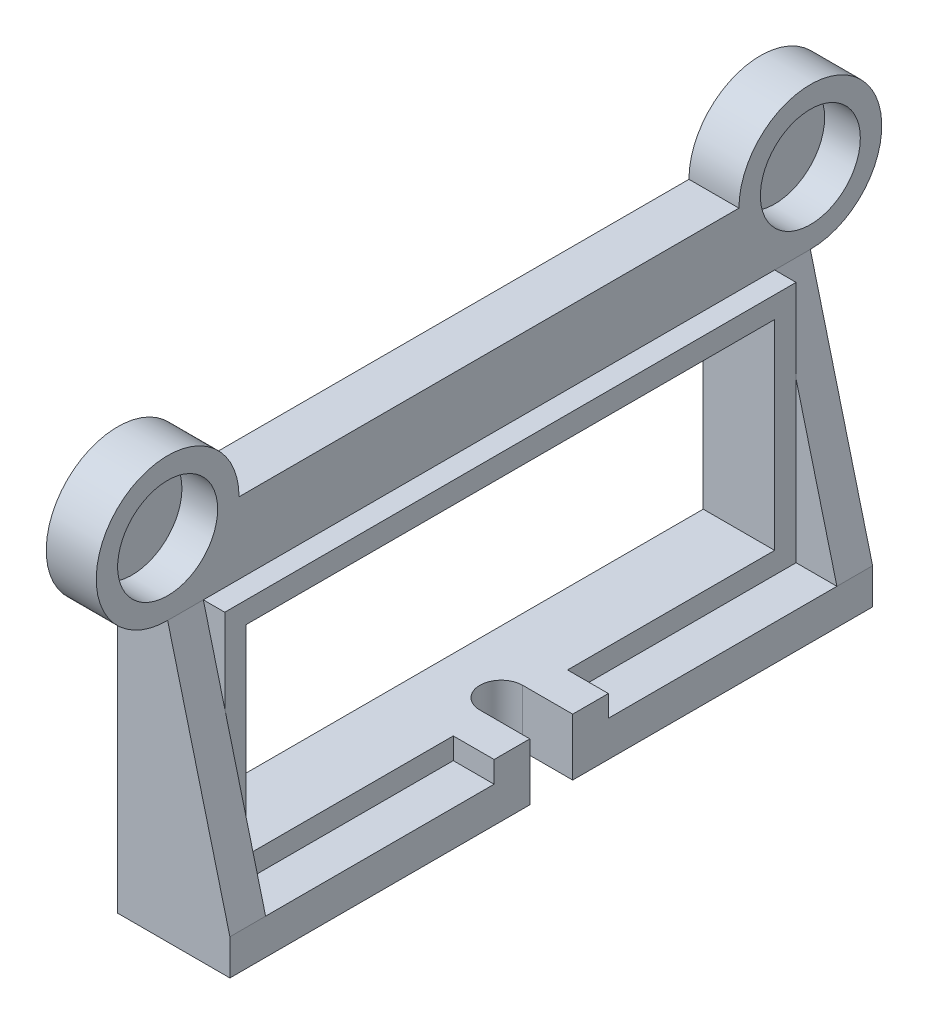
ISO-10303-21;
HEADER;
FILE_DESCRIPTION(('STEP AP214'),'2;1');
FILE_NAME('part.step','',(''),(''),'','','');
FILE_SCHEMA(('AUTOMOTIVE_DESIGN { 1 0 10303 214 1 1 1 1 }'));
ENDSEC;
DATA;
#1=APPLICATION_CONTEXT('core data for automotive mechanical design processes');
#2=APPLICATION_PROTOCOL_DEFINITION('international standard','automotive_design',2000,#1);
#3=PRODUCT_CONTEXT('',#1,'mechanical');
#4=PRODUCT('Part','Part','',(#3));
#5=PRODUCT_RELATED_PRODUCT_CATEGORY('part','',(#4));
#6=PRODUCT_DEFINITION_FORMATION('','',#4);
#7=PRODUCT_DEFINITION_CONTEXT('part definition',#1,'design');
#8=PRODUCT_DEFINITION('design','',#6,#7);
#9=PRODUCT_DEFINITION_SHAPE('','',#8);
#10=(LENGTH_UNIT() NAMED_UNIT(*) SI_UNIT(.MILLI.,.METRE.));
#11=(NAMED_UNIT(*) PLANE_ANGLE_UNIT() SI_UNIT($,.RADIAN.));
#12=(NAMED_UNIT(*) SI_UNIT($,.STERADIAN.) SOLID_ANGLE_UNIT());
#13=UNCERTAINTY_MEASURE_WITH_UNIT(LENGTH_MEASURE(1.E-05),#10,'distance_accuracy_value','');
#14=(GEOMETRIC_REPRESENTATION_CONTEXT(3) GLOBAL_UNCERTAINTY_ASSIGNED_CONTEXT((#13)) GLOBAL_UNIT_ASSIGNED_CONTEXT((#10,
#11,#12)) REPRESENTATION_CONTEXT('',''));
#15=CARTESIAN_POINT('',(0.,0.,0.));
#16=DIRECTION('',(0.,0.,1.));
#17=DIRECTION('',(1.,0.,0.));
#18=AXIS2_PLACEMENT_3D('',#15,#16,#17);
#19=CARTESIAN_POINT('',(15.7179487179487,0.,0.));
#20=DIRECTION('',(1.,0.,0.));
#21=DIRECTION('',(0.,0.,-1.));
#22=AXIS2_PLACEMENT_3D('',#19,#20,#21);
#23=PLANE('',#22);
#24=DIRECTION('',(0.,-1.,0.));
#25=VECTOR('',#24,1.);
#26=CARTESIAN_POINT('',(15.7179487179487,0.,-42.0000000000001));
#27=LINE('',#26,#25);
#28=CARTESIAN_POINT('',(15.7179487179487,-41.,-42.0000000000001));
#29=VERTEX_POINT('',#28);
#30=CARTESIAN_POINT('',(15.7179487179487,-49.,-42.0000000000001));
#31=VERTEX_POINT('',#30);
#32=EDGE_CURVE('E13',#29,#31,#27,.T.);
#33=ORIENTED_EDGE('',*,*,#32,.F.);
#34=DIRECTION('',(0.,0.,1.));
#35=VECTOR('',#34,1.);
#36=CARTESIAN_POINT('',(15.7179487179487,-41.,-37.0000000000001));
#37=LINE('',#36,#35);
#38=CARTESIAN_POINT('',(15.7179487179487,-41.,-37.0000000000001));
#39=VERTEX_POINT('',#38);
#40=EDGE_CURVE('E238',#29,#39,#37,.T.);
#41=ORIENTED_EDGE('',*,*,#40,.T.);
#42=DIRECTION('',(0.,-1.,0.));
#43=VECTOR('',#42,1.);
#44=CARTESIAN_POINT('',(15.7179487179487,-44.,-37.0000000000001));
#45=LINE('',#44,#43);
#46=CARTESIAN_POINT('',(15.7179487179487,-44.,-37.0000000000001));
#47=VERTEX_POINT('',#46);
#48=EDGE_CURVE('E77',#39,#47,#45,.T.);
#49=ORIENTED_EDGE('',*,*,#48,.T.);
#50=DIRECTION('',(0.,0.,1.));
#51=VECTOR('',#50,1.);
#52=CARTESIAN_POINT('',(15.7179487179487,-44.,-90.));
#53=LINE('',#52,#51);
#54=CARTESIAN_POINT('',(15.7179487179487,-44.,-5.00000000000006));
#55=VERTEX_POINT('',#54);
#56=EDGE_CURVE('E269',#47,#55,#53,.T.);
#57=ORIENTED_EDGE('',*,*,#56,.T.);
#58=DIRECTION('',(0.,0.,1.));
#59=VECTOR('',#58,1.);
#60=CARTESIAN_POINT('',(15.7179487179487,-44.,-100.));
#61=LINE('',#60,#59);
#62=CARTESIAN_POINT('',(15.7179487179487,-44.,0.));
#63=VERTEX_POINT('',#62);
#64=EDGE_CURVE('E286',#55,#63,#61,.T.);
#65=ORIENTED_EDGE('',*,*,#64,.T.);
#66=DIRECTION('',(0.,-1.,0.));
#67=VECTOR('',#66,1.);
#68=CARTESIAN_POINT('',(15.7179487179487,-44.,0.));
#69=LINE('',#68,#67);
#70=CARTESIAN_POINT('',(15.7179487179487,-49.,0.));
#71=VERTEX_POINT('',#70);
#72=EDGE_CURVE('E273',#63,#71,#69,.T.);
#73=ORIENTED_EDGE('',*,*,#72,.T.);
#74=DIRECTION('',(0.,0.,-1.));
#75=VECTOR('',#74,1.);
#76=CARTESIAN_POINT('',(15.7179487179487,-49.,0.));
#77=LINE('',#76,#75);
#78=EDGE_CURVE('E278',#71,#31,#77,.T.);
#79=ORIENTED_EDGE('',*,*,#78,.T.);
#80=EDGE_LOOP('',(#33,#41,#49,#57,#65,#73,#79));
#81=FACE_BOUND('',#80,.T.);
#82=ADVANCED_FACE('F53',(#81),#23,.T.);
#83=CARTESIAN_POINT('',(15.7179487179487,-44.,-90.));
#84=DIRECTION('',(0.,-1.,0.));
#85=DIRECTION('',(0.,0.,-1.));
#86=AXIS2_PLACEMENT_3D('',#83,#84,#85);
#87=PLANE('',#86);
#88=ORIENTED_EDGE('',*,*,#56,.F.);
#89=DIRECTION('',(1.,0.,0.));
#90=VECTOR('',#89,1.);
#91=CARTESIAN_POINT('',(-9.27882059609971,-44.,-37.0000000000001));
#92=LINE('',#91,#90);
#93=CARTESIAN_POINT('',(9.99999999999999,-44.,-37.0000000000001));
#94=VERTEX_POINT('',#93);
#95=EDGE_CURVE('E248',#94,#47,#92,.T.);
#96=ORIENTED_EDGE('',*,*,#95,.F.);
#97=DIRECTION('',(0.,0.,1.));
#98=VECTOR('',#97,1.);
#99=CARTESIAN_POINT('',(10.,-44.,-85.));
#100=LINE('',#99,#98);
#101=CARTESIAN_POINT('',(10.,-44.,-5.));
#102=VERTEX_POINT('',#101);
#103=EDGE_CURVE('E344',#94,#102,#100,.T.);
#104=ORIENTED_EDGE('',*,*,#103,.T.);
#105=DIRECTION('',(-1.,0.,0.));
#106=VECTOR('',#105,1.);
#107=CARTESIAN_POINT('',(17.,-44.,-5.));
#108=LINE('',#107,#106);
#109=EDGE_CURVE('E365',#55,#102,#108,.T.);
#110=ORIENTED_EDGE('',*,*,#109,.F.);
#111=EDGE_LOOP('',(#88,#96,#104,#110));
#112=FACE_BOUND('',#111,.T.);
#113=ADVANCED_FACE('F540',(#112),#87,.F.);
#114=CARTESIAN_POINT('',(7.,-10.,-100.));
#115=DIRECTION('',(-0.968663866044045,-0.248375350267704,0.));
#116=DIRECTION('',(0.248375350267704,-0.968663866044045,0.));
#117=AXIS2_PLACEMENT_3D('',#114,#115,#116);
#118=PLANE('',#117);
#119=DIRECTION('',(0.248375350267704,-0.968663866044045,0.));
#120=VECTOR('',#119,1.);
#121=CARTESIAN_POINT('',(7.,-10.,0.));
#122=LINE('',#121,#120);
#123=CARTESIAN_POINT('',(7.,-10.,0.));
#124=VERTEX_POINT('',#123);
#125=EDGE_CURVE('E377',#124,#63,#122,.T.);
#126=ORIENTED_EDGE('',*,*,#125,.T.);
#127=ORIENTED_EDGE('',*,*,#64,.F.);
#128=DIRECTION('',(-0.248375350267704,0.968663866044045,0.));
#129=VECTOR('',#128,1.);
#130=CARTESIAN_POINT('',(7.,-10.,-5.));
#131=LINE('',#130,#129);
#132=CARTESIAN_POINT('',(10.,-21.7,-5.));
#133=VERTEX_POINT('',#132);
#134=EDGE_CURVE('E459',#55,#133,#131,.T.);
#135=ORIENTED_EDGE('',*,*,#134,.T.);
#136=DIRECTION('',(-0.248375350267704,0.968663866044045,0.));
#137=VECTOR('',#136,1.);
#138=CARTESIAN_POINT('',(7.,-10.,-5.));
#139=LINE('',#138,#137);
#140=CARTESIAN_POINT('',(7.,-10.,-5.));
#141=VERTEX_POINT('',#140);
#142=EDGE_CURVE('E358',#133,#141,#139,.T.);
#143=ORIENTED_EDGE('',*,*,#142,.T.);
#144=DIRECTION('',(0.,0.,-1.));
#145=VECTOR('',#144,1.);
#146=CARTESIAN_POINT('',(7.,-10.,0.));
#147=LINE('',#146,#145);
#148=EDGE_CURVE('E396',#124,#141,#147,.T.);
#149=ORIENTED_EDGE('',*,*,#148,.F.);
#150=EDGE_LOOP('',(#126,#127,#135,#143,#149));
#151=FACE_BOUND('',#150,.T.);
#152=ADVANCED_FACE('F536',(#151),#118,.F.);
#153=CARTESIAN_POINT('',(17.,-10.,-5.));
#154=DIRECTION('',(0.,0.,1.));
#155=DIRECTION('',(1.,0.,0.));
#156=AXIS2_PLACEMENT_3D('',#153,#154,#155);
#157=PLANE('',#156);
#158=DIRECTION('',(0.,1.,0.));
#159=VECTOR('',#158,1.);
#160=CARTESIAN_POINT('',(10.,-44.,-5.));
#161=LINE('',#160,#159);
#162=EDGE_CURVE('E350',#102,#133,#161,.T.);
#163=ORIENTED_EDGE('',*,*,#162,.T.);
#164=ORIENTED_EDGE('',*,*,#134,.F.);
#165=ORIENTED_EDGE('',*,*,#109,.T.);
#166=EDGE_LOOP('',(#163,#164,#165));
#167=FACE_BOUND('',#166,.T.);
#168=ADVANCED_FACE('F539',(#167),#157,.F.);
#169=CARTESIAN_POINT('',(17.,-10.,-85.));
#170=DIRECTION('',(0.,0.,-1.));
#171=DIRECTION('',(-1.,0.,0.));
#172=AXIS2_PLACEMENT_3D('',#169,#170,#171);
#173=PLANE('',#172);
#174=DIRECTION('',(0.,1.,0.));
#175=VECTOR('',#174,1.);
#176=CARTESIAN_POINT('',(10.,-10.,-85.));
#177=LINE('',#176,#175);
#178=CARTESIAN_POINT('',(10.,-44.,-85.));
#179=VERTEX_POINT('',#178);
#180=CARTESIAN_POINT('',(10.,-21.7,-85.));
#181=VERTEX_POINT('',#180);
#182=EDGE_CURVE('E221',#179,#181,#177,.T.);
#183=ORIENTED_EDGE('',*,*,#182,.F.);
#184=DIRECTION('',(-1.,0.,0.));
#185=VECTOR('',#184,1.);
#186=CARTESIAN_POINT('',(17.,-44.,-85.));
#187=LINE('',#186,#185);
#188=CARTESIAN_POINT('',(15.7179487179487,-44.,-85.));
#189=VERTEX_POINT('',#188);
#190=EDGE_CURVE('E364',#189,#179,#187,.T.);
#191=ORIENTED_EDGE('',*,*,#190,.F.);
#192=DIRECTION('',(0.248375350267704,-0.968663866044045,0.));
#193=VECTOR('',#192,1.);
#194=CARTESIAN_POINT('',(7.,-10.,-85.));
#195=LINE('',#194,#193);
#196=EDGE_CURVE('E453',#181,#189,#195,.T.);
#197=ORIENTED_EDGE('',*,*,#196,.F.);
#198=EDGE_LOOP('',(#183,#191,#197));
#199=FACE_BOUND('',#198,.T.);
#200=ADVANCED_FACE('F563',(#199),#173,.F.);
#201=CARTESIAN_POINT('',(17.,0.,0.));
#202=DIRECTION('',(0.,1.,0.));
#203=DIRECTION('',(0.,0.,1.));
#204=AXIS2_PLACEMENT_3D('',#201,#202,#203);
#205=PLANE('',#204);
#206=DIRECTION('',(-1.,0.,0.));
#207=VECTOR('',#206,1.);
#208=CARTESIAN_POINT('',(17.,0.,-10.));
#209=LINE('',#208,#207);
#210=CARTESIAN_POINT('',(7.,0.,-10.));
#211=VERTEX_POINT('',#210);
#212=CARTESIAN_POINT('',(0.,0.,-10.));
#213=VERTEX_POINT('',#212);
#214=EDGE_CURVE('E444',#211,#213,#209,.T.);
#215=ORIENTED_EDGE('',*,*,#214,.F.);
#216=DIRECTION('',(0.,0.,1.));
#217=VECTOR('',#216,1.);
#218=CARTESIAN_POINT('',(7.,0.,-10.));
#219=LINE('',#218,#217);
#220=CARTESIAN_POINT('',(7.,0.,-80.));
#221=VERTEX_POINT('',#220);
#222=EDGE_CURVE('E400',#221,#211,#219,.T.);
#223=ORIENTED_EDGE('',*,*,#222,.F.);
#224=DIRECTION('',(-1.,0.,0.));
#225=VECTOR('',#224,1.);
#226=CARTESIAN_POINT('',(7.,0.,-80.));
#227=LINE('',#226,#225);
#228=CARTESIAN_POINT('',(0.,0.,-80.));
#229=VERTEX_POINT('',#228);
#230=EDGE_CURVE('E409',#221,#229,#227,.T.);
#231=ORIENTED_EDGE('',*,*,#230,.T.);
#232=DIRECTION('',(0.,0.,-1.));
#233=VECTOR('',#232,1.);
#234=CARTESIAN_POINT('',(0.,0.,0.));
#235=LINE('',#234,#233);
#236=EDGE_CURVE('E415',#213,#229,#235,.T.);
#237=ORIENTED_EDGE('',*,*,#236,.F.);
#238=EDGE_LOOP('',(#215,#223,#231,#237));
#239=FACE_BOUND('',#238,.T.);
#240=ADVANCED_FACE('F616',(#239),#205,.T.);
#241=CARTESIAN_POINT('',(7.,0.,0.));
#242=DIRECTION('',(-1.,0.,0.));
#243=DIRECTION('',(0.,0.,1.));
#244=AXIS2_PLACEMENT_3D('',#241,#242,#243);
#245=CYLINDRICAL_SURFACE('',#244,10.);
#246=CARTESIAN_POINT('',(7.,0.,0.));
#247=DIRECTION('',(1.,0.,0.));
#248=DIRECTION('',(0.,0.,-1.));
#249=AXIS2_PLACEMENT_3D('',#246,#247,#248);
#250=CIRCLE('',#249,10.);
#251=EDGE_CURVE('E449',#211,#124,#250,.T.);
#252=ORIENTED_EDGE('',*,*,#251,.F.);
#253=ORIENTED_EDGE('',*,*,#214,.T.);
#254=CARTESIAN_POINT('',(0.,0.,0.));
#255=DIRECTION('',(1.,0.,0.));
#256=DIRECTION('',(0.,0.,-1.));
#257=AXIS2_PLACEMENT_3D('',#254,#255,#256);
#258=CIRCLE('',#257,10.);
#259=CARTESIAN_POINT('',(0.,-10.,0.));
#260=VERTEX_POINT('',#259);
#261=EDGE_CURVE('E448',#213,#260,#258,.T.);
#262=ORIENTED_EDGE('',*,*,#261,.T.);
#263=DIRECTION('',(-1.,0.,0.));
#264=VECTOR('',#263,1.);
#265=CARTESIAN_POINT('',(17.,-10.,0.));
#266=LINE('',#265,#264);
#267=EDGE_CURVE('E440',#124,#260,#266,.T.);
#268=ORIENTED_EDGE('',*,*,#267,.F.);
#269=EDGE_LOOP('',(#252,#253,#262,#268));
#270=FACE_BOUND('',#269,.T.);
#271=ADVANCED_FACE('F55',(#270),#245,.T.);
#272=CARTESIAN_POINT('',(7.,0.,0.));
#273=DIRECTION('',(1.,0.,0.));
#274=DIRECTION('',(0.,0.,-1.));
#275=AXIS2_PLACEMENT_3D('',#272,#273,#274);
#276=PLANE('',#275);
#277=CARTESIAN_POINT('',(7.,0.,0.));
#278=DIRECTION('',(1.,0.,0.));
#279=DIRECTION('',(0.,0.,-1.));
#280=AXIS2_PLACEMENT_3D('',#277,#278,#279);
#281=CIRCLE('',#280,7.);
#282=CARTESIAN_POINT('',(7.,0.,-7.));
#283=VERTEX_POINT('',#282);
#284=EDGE_CURVE('E378',#283,#283,#281,.T.);
#285=ORIENTED_EDGE('',*,*,#284,.F.);
#286=EDGE_LOOP('',(#285));
#287=FACE_BOUND('',#286,.T.);
#288=CARTESIAN_POINT('',(7.,0.,-90.));
#289=DIRECTION('',(1.,0.,0.));
#290=DIRECTION('',(0.,0.,-1.));
#291=AXIS2_PLACEMENT_3D('',#288,#289,#290);
#292=CIRCLE('',#291,7.);
#293=CARTESIAN_POINT('',(7.,0.,-97.));
#294=VERTEX_POINT('',#293);
#295=EDGE_CURVE('E369',#294,#294,#292,.T.);
#296=ORIENTED_EDGE('',*,*,#295,.F.);
#297=EDGE_LOOP('',(#296));
#298=FACE_BOUND('',#297,.T.);
#299=ORIENTED_EDGE('',*,*,#251,.T.);
#300=ORIENTED_EDGE('',*,*,#148,.T.);
#301=CARTESIAN_POINT('',(7.,-10.,-85.));
#302=VERTEX_POINT('',#301);
#303=EDGE_CURVE('E401',#141,#302,#147,.T.);
#304=ORIENTED_EDGE('',*,*,#303,.T.);
#305=CARTESIAN_POINT('',(7.,-10.,-90.));
#306=VERTEX_POINT('',#305);
#307=EDGE_CURVE('E395',#302,#306,#147,.T.);
#308=ORIENTED_EDGE('',*,*,#307,.T.);
#309=CARTESIAN_POINT('',(7.,0.,-90.));
#310=DIRECTION('',(1.,0.,0.));
#311=DIRECTION('',(0.,0.,-1.));
#312=AXIS2_PLACEMENT_3D('',#309,#310,#311);
#313=CIRCLE('',#312,9.99999999999999);
#314=EDGE_CURVE('E405',#306,#221,#313,.T.);
#315=ORIENTED_EDGE('',*,*,#314,.T.);
#316=ORIENTED_EDGE('',*,*,#222,.T.);
#317=EDGE_LOOP('',(#299,#300,#304,#308,#315,#316));
#318=FACE_BOUND('',#317,.T.);
#319=ADVANCED_FACE('F602',(#287,#298,#318),#276,.T.);
#320=CARTESIAN_POINT('',(0.,0.,0.));
#321=DIRECTION('',(1.,0.,0.));
#322=DIRECTION('',(0.,0.,-1.));
#323=AXIS2_PLACEMENT_3D('',#320,#321,#322);
#324=PLANE('',#323);
#325=ORIENTED_EDGE('',*,*,#261,.F.);
#326=ORIENTED_EDGE('',*,*,#236,.T.);
#327=CARTESIAN_POINT('',(0.,0.,-90.));
#328=DIRECTION('',(1.,0.,0.));
#329=DIRECTION('',(0.,0.,-1.));
#330=AXIS2_PLACEMENT_3D('',#327,#328,#329);
#331=CIRCLE('',#330,9.99999999999999);
#332=CARTESIAN_POINT('',(0.,-9.99999999999999,-90.));
#333=VERTEX_POINT('',#332);
#334=EDGE_CURVE('E404',#333,#229,#331,.T.);
#335=ORIENTED_EDGE('',*,*,#334,.F.);
#336=DIRECTION('',(0.,1.,0.));
#337=VECTOR('',#336,1.);
#338=CARTESIAN_POINT('',(0.,0.,-90.));
#339=LINE('',#338,#337);
#340=CARTESIAN_POINT('',(0.,-49.,-90.));
#341=VERTEX_POINT('',#340);
#342=EDGE_CURVE('E427',#341,#333,#339,.T.);
#343=ORIENTED_EDGE('',*,*,#342,.F.);
#344=DIRECTION('',(0.,0.,-1.));
#345=VECTOR('',#344,1.);
#346=CARTESIAN_POINT('',(0.,-49.,0.));
#347=LINE('',#346,#345);
#348=CARTESIAN_POINT('',(0.,-49.,0.));
#349=VERTEX_POINT('',#348);
#350=EDGE_CURVE('E423',#349,#341,#347,.T.);
#351=ORIENTED_EDGE('',*,*,#350,.F.);
#352=DIRECTION('',(0.,-1.,0.));
#353=VECTOR('',#352,1.);
#354=CARTESIAN_POINT('',(0.,0.,0.));
#355=LINE('',#354,#353);
#356=EDGE_CURVE('E419',#260,#349,#355,.T.);
#357=ORIENTED_EDGE('',*,*,#356,.F.);
#358=EDGE_LOOP('',(#325,#326,#335,#343,#351,#357));
#359=FACE_BOUND('',#358,.T.);
#360=DIRECTION('',(0.,0.,-1.));
#361=VECTOR('',#360,1.);
#362=CARTESIAN_POINT('',(0.,-13.,-8.));
#363=LINE('',#362,#361);
#364=CARTESIAN_POINT('',(0.,-13.,-8.));
#365=VERTEX_POINT('',#364);
#366=CARTESIAN_POINT('',(0.,-13.,-82.));
#367=VERTEX_POINT('',#366);
#368=EDGE_CURVE('E310',#365,#367,#363,.T.);
#369=ORIENTED_EDGE('',*,*,#368,.F.);
#370=DIRECTION('',(0.,1.,0.));
#371=VECTOR('',#370,1.);
#372=CARTESIAN_POINT('',(0.,-41.,-8.00000000000001));
#373=LINE('',#372,#371);
#374=CARTESIAN_POINT('',(0.,-41.,-8.00000000000001));
#375=VERTEX_POINT('',#374);
#376=EDGE_CURVE('E296',#375,#365,#373,.T.);
#377=ORIENTED_EDGE('',*,*,#376,.F.);
#378=DIRECTION('',(0.,0.,1.));
#379=VECTOR('',#378,1.);
#380=CARTESIAN_POINT('',(0.,-41.,-82.));
#381=LINE('',#380,#379);
#382=CARTESIAN_POINT('',(0.,-41.,-82.));
#383=VERTEX_POINT('',#382);
#384=EDGE_CURVE('E317',#383,#375,#381,.T.);
#385=ORIENTED_EDGE('',*,*,#384,.F.);
#386=DIRECTION('',(0.,-1.,0.));
#387=VECTOR('',#386,1.);
#388=CARTESIAN_POINT('',(0.,-13.,-82.));
#389=LINE('',#388,#387);
#390=EDGE_CURVE('E313',#367,#383,#389,.T.);
#391=ORIENTED_EDGE('',*,*,#390,.F.);
#392=EDGE_LOOP('',(#369,#377,#385,#391));
#393=FACE_BOUND('',#392,.T.);
#394=ADVANCED_FACE('F618',(#359,#393),#324,.F.);
#395=CARTESIAN_POINT('',(17.,0.,0.));
#396=DIRECTION('',(0.,0.,-1.));
#397=DIRECTION('',(0.,1.,0.));
#398=AXIS2_PLACEMENT_3D('',#395,#396,#397);
#399=PLANE('',#398);
#400=DIRECTION('',(-1.,0.,0.));
#401=VECTOR('',#400,1.);
#402=CARTESIAN_POINT('',(17.,-49.,0.));
#403=LINE('',#402,#401);
#404=EDGE_CURVE('E437',#71,#349,#403,.T.);
#405=ORIENTED_EDGE('',*,*,#404,.F.);
#406=ORIENTED_EDGE('',*,*,#72,.F.);
#407=ORIENTED_EDGE('',*,*,#125,.F.);
#408=ORIENTED_EDGE('',*,*,#267,.T.);
#409=ORIENTED_EDGE('',*,*,#356,.T.);
#410=EDGE_LOOP('',(#405,#406,#407,#408,#409));
#411=FACE_BOUND('',#410,.T.);
#412=ADVANCED_FACE('F626',(#411),#399,.F.);
#413=CARTESIAN_POINT('',(17.,-49.,0.));
#414=DIRECTION('',(0.,1.,0.));
#415=DIRECTION('',(0.,0.,1.));
#416=AXIS2_PLACEMENT_3D('',#413,#414,#415);
#417=PLANE('',#416);
#418=CARTESIAN_POINT('',(8.71794871794872,-49.,-45.0000000000001));
#419=DIRECTION('',(0.,1.,0.));
#420=DIRECTION('',(0.,0.,1.));
#421=AXIS2_PLACEMENT_3D('',#418,#419,#420);
#422=CIRCLE('',#421,3.);
#423=CARTESIAN_POINT('',(8.71794871794872,-49.,-48.0000000000001));
#424=VERTEX_POINT('',#423);
#425=CARTESIAN_POINT('',(8.71794871794872,-49.,-42.0000000000001));
#426=VERTEX_POINT('',#425);
#427=EDGE_CURVE('E633',#424,#426,#422,.T.);
#428=ORIENTED_EDGE('',*,*,#427,.T.);
#429=DIRECTION('',(1.,0.,0.));
#430=VECTOR('',#429,1.);
#431=CARTESIAN_POINT('',(17.,-49.,-42.0000000000001));
#432=LINE('',#431,#430);
#433=EDGE_CURVE('E632',#426,#31,#432,.T.);
#434=ORIENTED_EDGE('',*,*,#433,.T.);
#435=ORIENTED_EDGE('',*,*,#78,.F.);
#436=ORIENTED_EDGE('',*,*,#404,.T.);
#437=ORIENTED_EDGE('',*,*,#350,.T.);
#438=DIRECTION('',(-1.,0.,0.));
#439=VECTOR('',#438,1.);
#440=CARTESIAN_POINT('',(17.,-49.,-90.));
#441=LINE('',#440,#439);
#442=CARTESIAN_POINT('',(15.7179487179487,-49.,-90.));
#443=VERTEX_POINT('',#442);
#444=EDGE_CURVE('E434',#443,#341,#441,.T.);
#445=ORIENTED_EDGE('',*,*,#444,.F.);
#446=CARTESIAN_POINT('',(15.7179487179487,-49.,-48.));
#447=VERTEX_POINT('',#446);
#448=EDGE_CURVE('E277',#447,#443,#77,.T.);
#449=ORIENTED_EDGE('',*,*,#448,.F.);
#450=DIRECTION('',(-1.,0.,0.));
#451=VECTOR('',#450,1.);
#452=CARTESIAN_POINT('',(17.,-49.,-48.0000000000001));
#453=LINE('',#452,#451);
#454=EDGE_CURVE('E69',#447,#424,#453,.T.);
#455=ORIENTED_EDGE('',*,*,#454,.T.);
#456=EDGE_LOOP('',(#428,#434,#435,#436,#437,#445,#449,#455));
#457=FACE_BOUND('',#456,.T.);
#458=ADVANCED_FACE('F631',(#457),#417,.F.);
#459=CARTESIAN_POINT('',(17.,0.,-90.));
#460=DIRECTION('',(0.,0.,1.));
#461=DIRECTION('',(1.,0.,0.));
#462=AXIS2_PLACEMENT_3D('',#459,#460,#461);
#463=PLANE('',#462);
#464=DIRECTION('',(0.,1.,0.));
#465=VECTOR('',#464,1.);
#466=CARTESIAN_POINT('',(15.7179487179487,-49.,-90.));
#467=LINE('',#466,#465);
#468=CARTESIAN_POINT('',(15.7179487179487,-44.,-90.));
#469=VERTEX_POINT('',#468);
#470=EDGE_CURVE('E282',#443,#469,#467,.T.);
#471=ORIENTED_EDGE('',*,*,#470,.F.);
#472=ORIENTED_EDGE('',*,*,#444,.T.);
#473=ORIENTED_EDGE('',*,*,#342,.T.);
#474=DIRECTION('',(-1.,0.,0.));
#475=VECTOR('',#474,1.);
#476=CARTESIAN_POINT('',(17.,-10.,-90.));
#477=LINE('',#476,#475);
#478=EDGE_CURVE('E430',#306,#333,#477,.T.);
#479=ORIENTED_EDGE('',*,*,#478,.F.);
#480=DIRECTION('',(0.248375350267704,-0.968663866044045,0.));
#481=VECTOR('',#480,1.);
#482=CARTESIAN_POINT('',(5.21098087600247,-3.02282541640963,-90.));
#483=LINE('',#482,#481);
#484=EDGE_CURVE('E391',#306,#469,#483,.T.);
#485=ORIENTED_EDGE('',*,*,#484,.T.);
#486=EDGE_LOOP('',(#471,#472,#473,#479,#485));
#487=FACE_BOUND('',#486,.T.);
#488=ADVANCED_FACE('F607',(#487),#463,.F.);
#489=CARTESIAN_POINT('',(7.,0.,-90.));
#490=DIRECTION('',(-1.,0.,0.));
#491=DIRECTION('',(0.,0.,1.));
#492=AXIS2_PLACEMENT_3D('',#489,#490,#491);
#493=CYLINDRICAL_SURFACE('',#492,9.99999999999999);
#494=ORIENTED_EDGE('',*,*,#230,.F.);
#495=ORIENTED_EDGE('',*,*,#314,.F.);
#496=ORIENTED_EDGE('',*,*,#478,.T.);
#497=ORIENTED_EDGE('',*,*,#334,.T.);
#498=EDGE_LOOP('',(#494,#495,#496,#497));
#499=FACE_BOUND('',#498,.T.);
#500=ADVANCED_FACE('F612',(#499),#493,.T.);
#501=ORIENTED_EDGE('',*,*,#196,.T.);
#502=EDGE_CURVE('E290',#469,#189,#61,.T.);
#503=ORIENTED_EDGE('',*,*,#502,.F.);
#504=ORIENTED_EDGE('',*,*,#484,.F.);
#505=ORIENTED_EDGE('',*,*,#307,.F.);
#506=EDGE_CURVE('E456',#302,#181,#195,.T.);
#507=ORIENTED_EDGE('',*,*,#506,.T.);
#508=EDGE_LOOP('',(#501,#503,#504,#505,#507));
#509=FACE_BOUND('',#508,.T.);
#510=ADVANCED_FACE('F565',(#509),#118,.F.);
#511=CARTESIAN_POINT('',(2.,0.,-90.));
#512=DIRECTION('',(1.,0.,0.));
#513=DIRECTION('',(0.,0.,-1.));
#514=AXIS2_PLACEMENT_3D('',#511,#512,#513);
#515=CYLINDRICAL_SURFACE('',#514,7.);
#516=CARTESIAN_POINT('',(2.,0.,-90.));
#517=DIRECTION('',(1.,0.,0.));
#518=DIRECTION('',(0.,0.,-1.));
#519=AXIS2_PLACEMENT_3D('',#516,#517,#518);
#520=CIRCLE('',#519,7.);
#521=CARTESIAN_POINT('',(2.,0.,-97.));
#522=VERTEX_POINT('',#521);
#523=EDGE_CURVE('E382',#522,#522,#520,.T.);
#524=ORIENTED_EDGE('',*,*,#523,.F.);
#525=EDGE_LOOP('',(#524));
#526=FACE_BOUND('',#525,.T.);
#527=ORIENTED_EDGE('',*,*,#295,.T.);
#528=EDGE_LOOP('',(#527));
#529=FACE_BOUND('',#528,.T.);
#530=ADVANCED_FACE('F715',(#526,#529),#515,.F.);
#531=CARTESIAN_POINT('',(2.,0.,-90.));
#532=DIRECTION('',(1.,0.,0.));
#533=DIRECTION('',(0.,0.,-1.));
#534=AXIS2_PLACEMENT_3D('',#531,#532,#533);
#535=PLANE('',#534);
#536=ORIENTED_EDGE('',*,*,#523,.T.);
#537=EDGE_LOOP('',(#536));
#538=FACE_BOUND('',#537,.T.);
#539=ADVANCED_FACE('F711',(#538),#535,.T.);
#540=CARTESIAN_POINT('',(2.,0.,0.));
#541=DIRECTION('',(1.,0.,0.));
#542=DIRECTION('',(0.,0.,-1.));
#543=AXIS2_PLACEMENT_3D('',#540,#541,#542);
#544=CYLINDRICAL_SURFACE('',#543,7.);
#545=CARTESIAN_POINT('',(2.,0.,0.));
#546=DIRECTION('',(1.,0.,0.));
#547=DIRECTION('',(0.,0.,-1.));
#548=AXIS2_PLACEMENT_3D('',#545,#546,#547);
#549=CIRCLE('',#548,7.);
#550=CARTESIAN_POINT('',(2.,0.,-7.));
#551=VERTEX_POINT('',#550);
#552=EDGE_CURVE('E373',#551,#551,#549,.T.);
#553=ORIENTED_EDGE('',*,*,#552,.F.);
#554=EDGE_LOOP('',(#553));
#555=FACE_BOUND('',#554,.T.);
#556=ORIENTED_EDGE('',*,*,#284,.T.);
#557=EDGE_LOOP('',(#556));
#558=FACE_BOUND('',#557,.T.);
#559=ADVANCED_FACE('F707',(#555,#558),#544,.F.);
#560=CARTESIAN_POINT('',(2.,0.,0.));
#561=DIRECTION('',(1.,0.,0.));
#562=DIRECTION('',(0.,0.,-1.));
#563=AXIS2_PLACEMENT_3D('',#560,#561,#562);
#564=PLANE('',#563);
#565=ORIENTED_EDGE('',*,*,#552,.T.);
#566=EDGE_LOOP('',(#565));
#567=FACE_BOUND('',#566,.T.);
#568=ADVANCED_FACE('F696',(#567),#564,.T.);
#569=CARTESIAN_POINT('',(10.,-44.,-5.));
#570=DIRECTION('',(0.,0.,1.));
#571=DIRECTION('',(1.,0.,0.));
#572=AXIS2_PLACEMENT_3D('',#569,#570,#571);
#573=PLANE('',#572);
#574=ORIENTED_EDGE('',*,*,#142,.F.);
#575=CARTESIAN_POINT('',(10.,-10.,-5.));
#576=VERTEX_POINT('',#575);
#577=EDGE_CURVE('E349',#133,#576,#161,.T.);
#578=ORIENTED_EDGE('',*,*,#577,.T.);
#579=DIRECTION('',(-1.,0.,0.));
#580=VECTOR('',#579,1.);
#581=CARTESIAN_POINT('',(10.,-10.,-5.));
#582=LINE('',#581,#580);
#583=EDGE_CURVE('E354',#576,#141,#582,.T.);
#584=ORIENTED_EDGE('',*,*,#583,.T.);
#585=EDGE_LOOP('',(#574,#578,#584));
#586=FACE_BOUND('',#585,.T.);
#587=ADVANCED_FACE('F693',(#586),#573,.T.);
#588=CARTESIAN_POINT('',(10.,-10.,-85.));
#589=DIRECTION('',(0.,0.,-1.));
#590=DIRECTION('',(-1.,0.,0.));
#591=AXIS2_PLACEMENT_3D('',#588,#589,#590);
#592=PLANE('',#591);
#593=ORIENTED_EDGE('',*,*,#506,.F.);
#594=DIRECTION('',(-1.,0.,0.));
#595=VECTOR('',#594,1.);
#596=CARTESIAN_POINT('',(10.,-10.,-85.));
#597=LINE('',#596,#595);
#598=CARTESIAN_POINT('',(10.,-10.,-85.));
#599=VERTEX_POINT('',#598);
#600=EDGE_CURVE('E353',#599,#302,#597,.T.);
#601=ORIENTED_EDGE('',*,*,#600,.F.);
#602=DIRECTION('',(0.,-1.,0.));
#603=VECTOR('',#602,1.);
#604=CARTESIAN_POINT('',(10.,-10.,-85.));
#605=LINE('',#604,#603);
#606=EDGE_CURVE('E340',#599,#181,#605,.T.);
#607=ORIENTED_EDGE('',*,*,#606,.T.);
#608=EDGE_LOOP('',(#593,#601,#607));
#609=FACE_BOUND('',#608,.T.);
#610=ADVANCED_FACE('F476',(#609),#592,.T.);
#611=CARTESIAN_POINT('',(10.,-10.,-5.));
#612=DIRECTION('',(0.,1.,0.));
#613=DIRECTION('',(0.,0.,1.));
#614=AXIS2_PLACEMENT_3D('',#611,#612,#613);
#615=PLANE('',#614);
#616=ORIENTED_EDGE('',*,*,#600,.T.);
#617=ORIENTED_EDGE('',*,*,#303,.F.);
#618=ORIENTED_EDGE('',*,*,#583,.F.);
#619=DIRECTION('',(0.,0.,-1.));
#620=VECTOR('',#619,1.);
#621=CARTESIAN_POINT('',(10.,-10.,-5.));
#622=LINE('',#621,#620);
#623=EDGE_CURVE('E327',#576,#599,#622,.T.);
#624=ORIENTED_EDGE('',*,*,#623,.T.);
#625=EDGE_LOOP('',(#616,#617,#618,#624));
#626=FACE_BOUND('',#625,.T.);
#627=ADVANCED_FACE('F479',(#626),#615,.T.);
#628=CARTESIAN_POINT('',(10.,0.,0.));
#629=DIRECTION('',(-1.,0.,0.));
#630=DIRECTION('',(0.,0.,1.));
#631=AXIS2_PLACEMENT_3D('',#628,#629,#630);
#632=PLANE('',#631);
#633=ORIENTED_EDGE('',*,*,#103,.F.);
#634=DIRECTION('',(0.,1.,0.));
#635=VECTOR('',#634,1.);
#636=CARTESIAN_POINT('',(10.,0.,-37.0000000000001));
#637=LINE('',#636,#635);
#638=CARTESIAN_POINT('',(9.99999999999999,-41.,-37.0000000000001));
#639=VERTEX_POINT('',#638);
#640=EDGE_CURVE('E265',#94,#639,#637,.T.);
#641=ORIENTED_EDGE('',*,*,#640,.T.);
#642=DIRECTION('',(0.,0.,1.));
#643=VECTOR('',#642,1.);
#644=CARTESIAN_POINT('',(10.,-41.,-82.));
#645=LINE('',#644,#643);
#646=CARTESIAN_POINT('',(10.,-41.,-8.00000000000001));
#647=VERTEX_POINT('',#646);
#648=EDGE_CURVE('E300',#639,#647,#645,.T.);
#649=ORIENTED_EDGE('',*,*,#648,.T.);
#650=DIRECTION('',(0.,1.,0.));
#651=VECTOR('',#650,1.);
#652=CARTESIAN_POINT('',(10.,-41.,-8.00000000000001));
#653=LINE('',#652,#651);
#654=CARTESIAN_POINT('',(10.,-13.,-8.));
#655=VERTEX_POINT('',#654);
#656=EDGE_CURVE('E305',#647,#655,#653,.T.);
#657=ORIENTED_EDGE('',*,*,#656,.T.);
#658=DIRECTION('',(0.,0.,-1.));
#659=VECTOR('',#658,1.);
#660=CARTESIAN_POINT('',(10.,-13.,-8.));
#661=LINE('',#660,#659);
#662=CARTESIAN_POINT('',(10.,-13.,-82.));
#663=VERTEX_POINT('',#662);
#664=EDGE_CURVE('E291',#655,#663,#661,.T.);
#665=ORIENTED_EDGE('',*,*,#664,.T.);
#666=DIRECTION('',(0.,-1.,0.));
#667=VECTOR('',#666,1.);
#668=CARTESIAN_POINT('',(10.,-13.,-82.));
#669=LINE('',#668,#667);
#670=CARTESIAN_POINT('',(10.,-41.,-82.));
#671=VERTEX_POINT('',#670);
#672=EDGE_CURVE('E295',#663,#671,#669,.T.);
#673=ORIENTED_EDGE('',*,*,#672,.T.);
#674=CARTESIAN_POINT('',(9.99999999999999,-41.,-53.0000000000001));
#675=VERTEX_POINT('',#674);
#676=EDGE_CURVE('E301',#671,#675,#645,.T.);
#677=ORIENTED_EDGE('',*,*,#676,.T.);
#678=DIRECTION('',(0.,-1.,0.));
#679=VECTOR('',#678,1.);
#680=CARTESIAN_POINT('',(10.,0.,-53.0000000000001));
#681=LINE('',#680,#679);
#682=CARTESIAN_POINT('',(9.99999999999999,-44.,-53.0000000000001));
#683=VERTEX_POINT('',#682);
#684=EDGE_CURVE('E251',#675,#683,#681,.T.);
#685=ORIENTED_EDGE('',*,*,#684,.T.);
#686=EDGE_CURVE('E345',#179,#683,#100,.T.);
#687=ORIENTED_EDGE('',*,*,#686,.F.);
#688=ORIENTED_EDGE('',*,*,#182,.T.);
#689=ORIENTED_EDGE('',*,*,#606,.F.);
#690=ORIENTED_EDGE('',*,*,#623,.F.);
#691=ORIENTED_EDGE('',*,*,#577,.F.);
#692=ORIENTED_EDGE('',*,*,#162,.F.);
#693=EDGE_LOOP('',(#633,#641,#649,#657,#665,#673,#677,#685,#687,#688,#689,#690,#691,#692));
#694=FACE_BOUND('',#693,.T.);
#695=ADVANCED_FACE('F470',(#694),#632,.F.);
#696=CARTESIAN_POINT('',(10.,-13.,-8.));
#697=DIRECTION('',(0.,1.,0.));
#698=DIRECTION('',(0.,0.,1.));
#699=AXIS2_PLACEMENT_3D('',#696,#697,#698);
#700=PLANE('',#699);
#701=ORIENTED_EDGE('',*,*,#368,.T.);
#702=DIRECTION('',(-1.,0.,0.));
#703=VECTOR('',#702,1.);
#704=CARTESIAN_POINT('',(10.,-13.,-82.));
#705=LINE('',#704,#703);
#706=EDGE_CURVE('E309',#663,#367,#705,.T.);
#707=ORIENTED_EDGE('',*,*,#706,.F.);
#708=ORIENTED_EDGE('',*,*,#664,.F.);
#709=DIRECTION('',(-1.,0.,0.));
#710=VECTOR('',#709,1.);
#711=CARTESIAN_POINT('',(10.,-13.,-8.));
#712=LINE('',#711,#710);
#713=EDGE_CURVE('E324',#655,#365,#712,.T.);
#714=ORIENTED_EDGE('',*,*,#713,.T.);
#715=EDGE_LOOP('',(#701,#707,#708,#714));
#716=FACE_BOUND('',#715,.T.);
#717=ADVANCED_FACE('F552',(#716),#700,.F.);
#718=CARTESIAN_POINT('',(10.,-41.,-8.00000000000001));
#719=DIRECTION('',(0.,0.,1.));
#720=DIRECTION('',(0.,-1.,0.));
#721=AXIS2_PLACEMENT_3D('',#718,#719,#720);
#722=PLANE('',#721);
#723=ORIENTED_EDGE('',*,*,#376,.T.);
#724=ORIENTED_EDGE('',*,*,#713,.F.);
#725=ORIENTED_EDGE('',*,*,#656,.F.);
#726=DIRECTION('',(-1.,0.,0.));
#727=VECTOR('',#726,1.);
#728=CARTESIAN_POINT('',(10.,-41.,-8.00000000000001));
#729=LINE('',#728,#727);
#730=EDGE_CURVE('E328',#647,#375,#729,.T.);
#731=ORIENTED_EDGE('',*,*,#730,.T.);
#732=EDGE_LOOP('',(#723,#724,#725,#731));
#733=FACE_BOUND('',#732,.T.);
#734=ADVANCED_FACE('F548',(#733),#722,.F.);
#735=CARTESIAN_POINT('',(10.,-41.,-82.));
#736=DIRECTION('',(0.,-1.,0.));
#737=DIRECTION('',(0.,0.,-1.));
#738=AXIS2_PLACEMENT_3D('',#735,#736,#737);
#739=PLANE('',#738);
#740=ORIENTED_EDGE('',*,*,#40,.F.);
#741=DIRECTION('',(1.,0.,0.));
#742=VECTOR('',#741,1.);
#743=CARTESIAN_POINT('',(15.7179487179487,-41.,-42.0000000000001));
#744=LINE('',#743,#742);
#745=CARTESIAN_POINT('',(8.71794871794872,-41.,-42.0000000000001));
#746=VERTEX_POINT('',#745);
#747=EDGE_CURVE('E647',#746,#29,#744,.T.);
#748=ORIENTED_EDGE('',*,*,#747,.F.);
#749=CARTESIAN_POINT('',(8.71794871794872,-41.,-45.0000000000001));
#750=DIRECTION('',(0.,1.,0.));
#751=DIRECTION('',(0.,0.,-1.));
#752=AXIS2_PLACEMENT_3D('',#749,#750,#751);
#753=CIRCLE('',#752,3.);
#754=CARTESIAN_POINT('',(8.71794871794872,-41.,-48.0000000000001));
#755=VERTEX_POINT('',#754);
#756=EDGE_CURVE('E231',#755,#746,#753,.T.);
#757=ORIENTED_EDGE('',*,*,#756,.F.);
#758=DIRECTION('',(-1.,0.,0.));
#759=VECTOR('',#758,1.);
#760=CARTESIAN_POINT('',(15.7179487179487,-41.,-48.0000000000001));
#761=LINE('',#760,#759);
#762=CARTESIAN_POINT('',(15.7179487179487,-41.,-48.0000000000001));
#763=VERTEX_POINT('',#762);
#764=EDGE_CURVE('E215',#763,#755,#761,.T.);
#765=ORIENTED_EDGE('',*,*,#764,.F.);
#766=CARTESIAN_POINT('',(15.7179487179487,-41.,-53.0000000000001));
#767=VERTEX_POINT('',#766);
#768=EDGE_CURVE('E227',#767,#763,#37,.T.);
#769=ORIENTED_EDGE('',*,*,#768,.F.);
#770=DIRECTION('',(1.,0.,0.));
#771=VECTOR('',#770,1.);
#772=CARTESIAN_POINT('',(-9.27882059609971,-41.,-53.0000000000001));
#773=LINE('',#772,#771);
#774=EDGE_CURVE('E256',#675,#767,#773,.T.);
#775=ORIENTED_EDGE('',*,*,#774,.F.);
#776=ORIENTED_EDGE('',*,*,#676,.F.);
#777=DIRECTION('',(-1.,0.,0.));
#778=VECTOR('',#777,1.);
#779=CARTESIAN_POINT('',(10.,-41.,-82.));
#780=LINE('',#779,#778);
#781=EDGE_CURVE('E331',#671,#383,#780,.T.);
#782=ORIENTED_EDGE('',*,*,#781,.T.);
#783=ORIENTED_EDGE('',*,*,#384,.T.);
#784=ORIENTED_EDGE('',*,*,#730,.F.);
#785=ORIENTED_EDGE('',*,*,#648,.F.);
#786=DIRECTION('',(1.,0.,0.));
#787=VECTOR('',#786,1.);
#788=CARTESIAN_POINT('',(-9.27882059609971,-41.,-37.0000000000001));
#789=LINE('',#788,#787);
#790=EDGE_CURVE('E252',#639,#39,#789,.T.);
#791=ORIENTED_EDGE('',*,*,#790,.T.);
#792=EDGE_LOOP('',(#740,#748,#757,#765,#769,#775,#776,#782,#783,#784,#785,#791));
#793=FACE_BOUND('',#792,.T.);
#794=ADVANCED_FACE('F225',(#793),#739,.F.);
#795=CARTESIAN_POINT('',(10.,-13.,-82.));
#796=DIRECTION('',(0.,0.,-1.));
#797=DIRECTION('',(-1.,0.,0.));
#798=AXIS2_PLACEMENT_3D('',#795,#796,#797);
#799=PLANE('',#798);
#800=ORIENTED_EDGE('',*,*,#390,.T.);
#801=ORIENTED_EDGE('',*,*,#781,.F.);
#802=ORIENTED_EDGE('',*,*,#672,.F.);
#803=ORIENTED_EDGE('',*,*,#706,.T.);
#804=EDGE_LOOP('',(#800,#801,#802,#803));
#805=FACE_BOUND('',#804,.T.);
#806=ADVANCED_FACE('F557',(#805),#799,.F.);
#807=ORIENTED_EDGE('',*,*,#686,.T.);
#808=DIRECTION('',(1.,0.,0.));
#809=VECTOR('',#808,1.);
#810=CARTESIAN_POINT('',(-9.27882059609971,-44.,-53.0000000000001));
#811=LINE('',#810,#809);
#812=CARTESIAN_POINT('',(15.7179487179487,-44.,-53.0000000000001));
#813=VERTEX_POINT('',#812);
#814=EDGE_CURVE('E243',#683,#813,#811,.T.);
#815=ORIENTED_EDGE('',*,*,#814,.T.);
#816=EDGE_CURVE('E270',#189,#813,#53,.T.);
#817=ORIENTED_EDGE('',*,*,#816,.F.);
#818=ORIENTED_EDGE('',*,*,#190,.T.);
#819=EDGE_LOOP('',(#807,#815,#817,#818));
#820=FACE_BOUND('',#819,.T.);
#821=ADVANCED_FACE('F560',(#820),#87,.F.);
#822=DIRECTION('',(0.,1.,0.));
#823=VECTOR('',#822,1.);
#824=CARTESIAN_POINT('',(15.7179487179487,0.,-48.0000000000001));
#825=LINE('',#824,#823);
#826=EDGE_CURVE('E62',#447,#763,#825,.T.);
#827=ORIENTED_EDGE('',*,*,#826,.F.);
#828=ORIENTED_EDGE('',*,*,#448,.T.);
#829=ORIENTED_EDGE('',*,*,#470,.T.);
#830=ORIENTED_EDGE('',*,*,#502,.T.);
#831=ORIENTED_EDGE('',*,*,#816,.T.);
#832=DIRECTION('',(0.,1.,0.));
#833=VECTOR('',#832,1.);
#834=CARTESIAN_POINT('',(15.7179487179487,-41.,-53.0000000000001));
#835=LINE('',#834,#833);
#836=EDGE_CURVE('E236',#813,#767,#835,.T.);
#837=ORIENTED_EDGE('',*,*,#836,.T.);
#838=ORIENTED_EDGE('',*,*,#768,.T.);
#839=EDGE_LOOP('',(#827,#828,#829,#830,#831,#837,#838));
#840=FACE_BOUND('',#839,.T.);
#841=ADVANCED_FACE('F234',(#840),#23,.T.);
#842=CARTESIAN_POINT('',(-9.27882059609971,-44.,-37.0000000000001));
#843=DIRECTION('',(0.,0.,1.));
#844=DIRECTION('',(1.,0.,0.));
#845=AXIS2_PLACEMENT_3D('',#842,#843,#844);
#846=PLANE('',#845);
#847=ORIENTED_EDGE('',*,*,#640,.F.);
#848=ORIENTED_EDGE('',*,*,#95,.T.);
#849=ORIENTED_EDGE('',*,*,#48,.F.);
#850=ORIENTED_EDGE('',*,*,#790,.F.);
#851=EDGE_LOOP('',(#847,#848,#849,#850));
#852=FACE_BOUND('',#851,.T.);
#853=ADVANCED_FACE('F674',(#852),#846,.T.);
#854=CARTESIAN_POINT('',(-9.27882059609971,-41.,-53.0000000000001));
#855=DIRECTION('',(0.,0.,-1.));
#856=DIRECTION('',(-1.,0.,0.));
#857=AXIS2_PLACEMENT_3D('',#854,#855,#856);
#858=PLANE('',#857);
#859=ORIENTED_EDGE('',*,*,#684,.F.);
#860=ORIENTED_EDGE('',*,*,#774,.T.);
#861=ORIENTED_EDGE('',*,*,#836,.F.);
#862=ORIENTED_EDGE('',*,*,#814,.F.);
#863=EDGE_LOOP('',(#859,#860,#861,#862));
#864=FACE_BOUND('',#863,.T.);
#865=ADVANCED_FACE('F664',(#864),#858,.T.);
#866=CARTESIAN_POINT('',(8.71794871794872,-52.,-45.0000000000001));
#867=DIRECTION('',(0.,1.,0.));
#868=DIRECTION('',(0.,0.,1.));
#869=AXIS2_PLACEMENT_3D('',#866,#867,#868);
#870=CYLINDRICAL_SURFACE('',#869,3.);
#871=DIRECTION('',(0.,1.,0.));
#872=VECTOR('',#871,1.);
#873=CARTESIAN_POINT('',(8.71794871794872,-52.,-48.0000000000001));
#874=LINE('',#873,#872);
#875=EDGE_CURVE('E644',#424,#755,#874,.T.);
#876=ORIENTED_EDGE('',*,*,#875,.T.);
#877=ORIENTED_EDGE('',*,*,#756,.T.);
#878=DIRECTION('',(0.,1.,0.));
#879=VECTOR('',#878,1.);
#880=CARTESIAN_POINT('',(8.71794871794872,-52.,-42.0000000000001));
#881=LINE('',#880,#879);
#882=EDGE_CURVE('E641',#426,#746,#881,.T.);
#883=ORIENTED_EDGE('',*,*,#882,.F.);
#884=ORIENTED_EDGE('',*,*,#427,.F.);
#885=EDGE_LOOP('',(#876,#877,#883,#884));
#886=FACE_BOUND('',#885,.T.);
#887=ADVANCED_FACE('F655',(#886),#870,.F.);
#888=CARTESIAN_POINT('',(15.7179487179487,-52.,-42.0000000000001));
#889=DIRECTION('',(0.,0.,1.));
#890=DIRECTION('',(1.,0.,0.));
#891=AXIS2_PLACEMENT_3D('',#888,#889,#890);
#892=PLANE('',#891);
#893=ORIENTED_EDGE('',*,*,#882,.T.);
#894=ORIENTED_EDGE('',*,*,#747,.T.);
#895=ORIENTED_EDGE('',*,*,#32,.T.);
#896=ORIENTED_EDGE('',*,*,#433,.F.);
#897=EDGE_LOOP('',(#893,#894,#895,#896));
#898=FACE_BOUND('',#897,.T.);
#899=ADVANCED_FACE('F656',(#898),#892,.F.);
#900=CARTESIAN_POINT('',(15.7179487179487,-52.,-48.0000000000001));
#901=DIRECTION('',(0.,0.,-1.));
#902=DIRECTION('',(-1.,0.,0.));
#903=AXIS2_PLACEMENT_3D('',#900,#901,#902);
#904=PLANE('',#903);
#905=ORIENTED_EDGE('',*,*,#826,.T.);
#906=ORIENTED_EDGE('',*,*,#764,.T.);
#907=ORIENTED_EDGE('',*,*,#875,.F.);
#908=ORIENTED_EDGE('',*,*,#454,.F.);
#909=EDGE_LOOP('',(#905,#906,#907,#908));
#910=FACE_BOUND('',#909,.T.);
#911=ADVANCED_FACE('F214',(#910),#904,.F.);
#912=CLOSED_SHELL('',(#82,#113,#152,#168,#200,#240,#271,#319,#394,#412,#458,#488,#500,#510,#530,
#539,#559,#568,#587,#610,#627,#695,#717,#734,#794,#806,#821,#841,#853,#865,#887,#899,#911));
#913=MANIFOLD_SOLID_BREP('B2',#912);
#914=ADVANCED_BREP_SHAPE_REPRESENTATION('',(#18,#913),#14);
#915=SHAPE_DEFINITION_REPRESENTATION(#9,#914);
ENDSEC;
END-ISO-10303-21;
